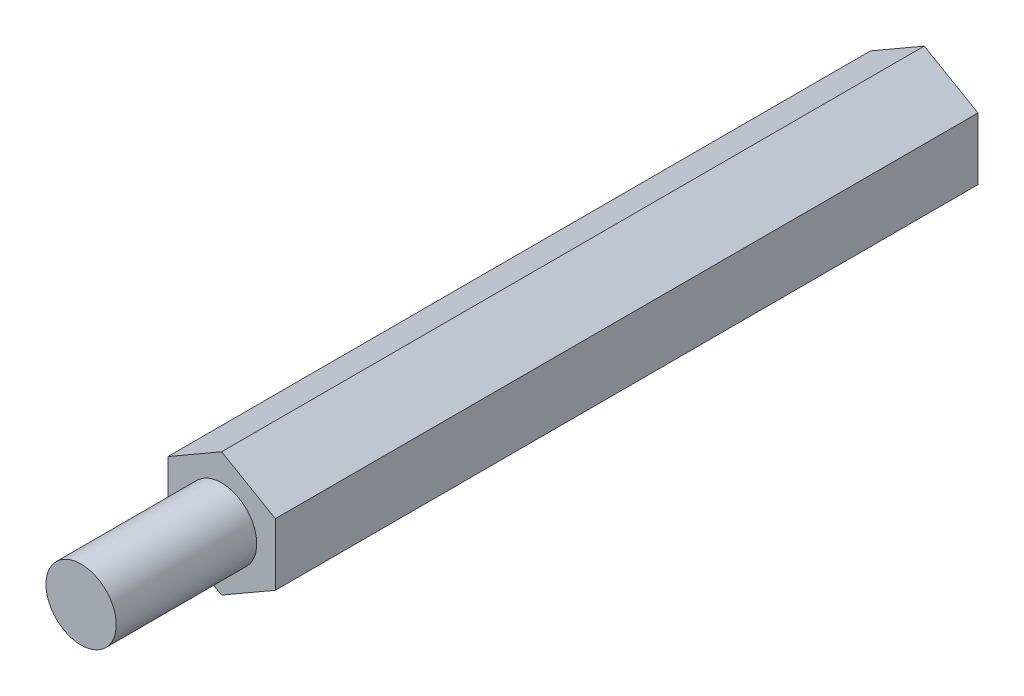
ISO-10303-21;
HEADER;
FILE_DESCRIPTION(('STEP AP214'),'2;1');
FILE_NAME('part.step','',(''),(''),'','','');
FILE_SCHEMA(('AUTOMOTIVE_DESIGN { 1 0 10303 214 1 1 1 1 }'));
ENDSEC;
DATA;
#1=APPLICATION_CONTEXT('core data for automotive mechanical design processes');
#2=APPLICATION_PROTOCOL_DEFINITION('international standard','automotive_design',2000,#1);
#3=PRODUCT_CONTEXT('',#1,'mechanical');
#4=PRODUCT('Part','Part','',(#3));
#5=PRODUCT_RELATED_PRODUCT_CATEGORY('part','',(#4));
#6=PRODUCT_DEFINITION_FORMATION('','',#4);
#7=PRODUCT_DEFINITION_CONTEXT('part definition',#1,'design');
#8=PRODUCT_DEFINITION('design','',#6,#7);
#9=PRODUCT_DEFINITION_SHAPE('','',#8);
#10=(LENGTH_UNIT() NAMED_UNIT(*) SI_UNIT(.MILLI.,.METRE.));
#11=(NAMED_UNIT(*) PLANE_ANGLE_UNIT() SI_UNIT($,.RADIAN.));
#12=(NAMED_UNIT(*) SI_UNIT($,.STERADIAN.) SOLID_ANGLE_UNIT());
#13=UNCERTAINTY_MEASURE_WITH_UNIT(LENGTH_MEASURE(1.E-05),#10,'distance_accuracy_value','');
#14=(GEOMETRIC_REPRESENTATION_CONTEXT(3) GLOBAL_UNCERTAINTY_ASSIGNED_CONTEXT((#13)) GLOBAL_UNIT_ASSIGNED_CONTEXT((#10,
#11,#12)) REPRESENTATION_CONTEXT('',''));
#15=CARTESIAN_POINT('',(0.,0.,0.));
#16=DIRECTION('',(0.,0.,1.));
#17=DIRECTION('',(1.,0.,0.));
#18=AXIS2_PLACEMENT_3D('',#15,#16,#17);
#19=CARTESIAN_POINT('',(2.29496732002877,1.325,30.));
#20=DIRECTION('',(-0.500000000000001,-0.866025403784438,0.));
#21=DIRECTION('',(0.866025403784438,-0.500000000000001,0.));
#22=AXIS2_PLACEMENT_3D('',#19,#20,#21);
#23=PLANE('',#22);
#24=DIRECTION('',(-0.866025403784438,0.500000000000001,0.));
#25=VECTOR('',#24,1.);
#26=CARTESIAN_POINT('',(2.29496732002877,1.325,0.));
#27=LINE('',#26,#25);
#28=CARTESIAN_POINT('',(2.29496732002877,1.325,0.));
#29=VERTEX_POINT('',#28);
#30=CARTESIAN_POINT('',(0.,2.65,0.));
#31=VERTEX_POINT('',#30);
#32=EDGE_CURVE('E130',#29,#31,#27,.T.);
#33=ORIENTED_EDGE('',*,*,#32,.T.);
#34=DIRECTION('',(0.,0.,-1.));
#35=VECTOR('',#34,1.);
#36=CARTESIAN_POINT('',(0.,2.65,30.));
#37=LINE('',#36,#35);
#38=CARTESIAN_POINT('',(0.,2.65,30.));
#39=VERTEX_POINT('',#38);
#40=EDGE_CURVE('E42',#39,#31,#37,.T.);
#41=ORIENTED_EDGE('',*,*,#40,.F.);
#42=DIRECTION('',(-0.866025403784438,0.500000000000001,0.));
#43=VECTOR('',#42,1.);
#44=CARTESIAN_POINT('',(2.29496732002877,1.325,30.));
#45=LINE('',#44,#43);
#46=CARTESIAN_POINT('',(2.29496732002877,1.325,30.));
#47=VERTEX_POINT('',#46);
#48=EDGE_CURVE('E147',#47,#39,#45,.T.);
#49=ORIENTED_EDGE('',*,*,#48,.F.);
#50=DIRECTION('',(0.,0.,-1.));
#51=VECTOR('',#50,1.);
#52=CARTESIAN_POINT('',(2.29496732002877,1.325,30.));
#53=LINE('',#52,#51);
#54=EDGE_CURVE('E126',#47,#29,#53,.T.);
#55=ORIENTED_EDGE('',*,*,#54,.T.);
#56=EDGE_LOOP('',(#33,#41,#49,#55));
#57=FACE_BOUND('',#56,.T.);
#58=ADVANCED_FACE('F39',(#57),#23,.F.);
#59=CARTESIAN_POINT('',(0.,2.65,30.));
#60=DIRECTION('',(0.5,-0.866025403784439,0.));
#61=DIRECTION('',(0.866025403784439,0.5,0.));
#62=AXIS2_PLACEMENT_3D('',#59,#60,#61);
#63=PLANE('',#62);
#64=DIRECTION('',(-0.866025403784439,-0.5,0.));
#65=VECTOR('',#64,1.);
#66=CARTESIAN_POINT('',(0.,2.65,0.));
#67=LINE('',#66,#65);
#68=CARTESIAN_POINT('',(-2.29496732002876,1.325,0.));
#69=VERTEX_POINT('',#68);
#70=EDGE_CURVE('E134',#31,#69,#67,.T.);
#71=ORIENTED_EDGE('',*,*,#70,.T.);
#72=DIRECTION('',(0.,0.,-1.));
#73=VECTOR('',#72,1.);
#74=CARTESIAN_POINT('',(-2.29496732002876,1.325,30.));
#75=LINE('',#74,#73);
#76=CARTESIAN_POINT('',(-2.29496732002876,1.325,30.));
#77=VERTEX_POINT('',#76);
#78=EDGE_CURVE('E153',#77,#69,#75,.T.);
#79=ORIENTED_EDGE('',*,*,#78,.F.);
#80=DIRECTION('',(-0.866025403784439,-0.5,0.));
#81=VECTOR('',#80,1.);
#82=CARTESIAN_POINT('',(0.,2.65,30.));
#83=LINE('',#82,#81);
#84=EDGE_CURVE('E95',#39,#77,#83,.T.);
#85=ORIENTED_EDGE('',*,*,#84,.F.);
#86=ORIENTED_EDGE('',*,*,#40,.T.);
#87=EDGE_LOOP('',(#71,#79,#85,#86));
#88=FACE_BOUND('',#87,.T.);
#89=ADVANCED_FACE('F160',(#88),#63,.F.);
#90=CARTESIAN_POINT('',(-2.29496732002876,1.325,30.));
#91=DIRECTION('',(1.,0.,0.));
#92=DIRECTION('',(0.,0.,-1.));
#93=AXIS2_PLACEMENT_3D('',#90,#91,#92);
#94=PLANE('',#93);
#95=DIRECTION('',(0.,-1.,0.));
#96=VECTOR('',#95,1.);
#97=CARTESIAN_POINT('',(-2.29496732002876,1.325,0.));
#98=LINE('',#97,#96);
#99=CARTESIAN_POINT('',(-2.29496732002876,-1.325,0.));
#100=VERTEX_POINT('',#99);
#101=EDGE_CURVE('E138',#69,#100,#98,.T.);
#102=ORIENTED_EDGE('',*,*,#101,.T.);
#103=DIRECTION('',(0.,0.,-1.));
#104=VECTOR('',#103,1.);
#105=CARTESIAN_POINT('',(-2.29496732002876,-1.325,30.));
#106=LINE('',#105,#104);
#107=CARTESIAN_POINT('',(-2.29496732002876,-1.325,30.));
#108=VERTEX_POINT('',#107);
#109=EDGE_CURVE('E119',#108,#100,#106,.T.);
#110=ORIENTED_EDGE('',*,*,#109,.F.);
#111=DIRECTION('',(0.,-1.,0.));
#112=VECTOR('',#111,1.);
#113=CARTESIAN_POINT('',(-2.29496732002876,1.325,30.));
#114=LINE('',#113,#112);
#115=EDGE_CURVE('E108',#77,#108,#114,.T.);
#116=ORIENTED_EDGE('',*,*,#115,.F.);
#117=ORIENTED_EDGE('',*,*,#78,.T.);
#118=EDGE_LOOP('',(#102,#110,#116,#117));
#119=FACE_BOUND('',#118,.T.);
#120=ADVANCED_FACE('F166',(#119),#94,.F.);
#121=CARTESIAN_POINT('',(-2.29496732002876,-1.325,30.));
#122=DIRECTION('',(0.5,0.866025403784438,0.));
#123=DIRECTION('',(-0.866025403784438,0.5,0.));
#124=AXIS2_PLACEMENT_3D('',#121,#122,#123);
#125=PLANE('',#124);
#126=DIRECTION('',(0.866025403784438,-0.5,0.));
#127=VECTOR('',#126,1.);
#128=CARTESIAN_POINT('',(-2.29496732002876,-1.325,0.));
#129=LINE('',#128,#127);
#130=CARTESIAN_POINT('',(0.,-2.65,0.));
#131=VERTEX_POINT('',#130);
#132=EDGE_CURVE('E117',#100,#131,#129,.T.);
#133=ORIENTED_EDGE('',*,*,#132,.T.);
#134=DIRECTION('',(0.,0.,-1.));
#135=VECTOR('',#134,1.);
#136=CARTESIAN_POINT('',(0.,-2.65,30.));
#137=LINE('',#136,#135);
#138=CARTESIAN_POINT('',(0.,-2.65,30.));
#139=VERTEX_POINT('',#138);
#140=EDGE_CURVE('E114',#139,#131,#137,.T.);
#141=ORIENTED_EDGE('',*,*,#140,.F.);
#142=DIRECTION('',(0.866025403784438,-0.5,0.));
#143=VECTOR('',#142,1.);
#144=CARTESIAN_POINT('',(-2.29496732002876,-1.325,30.));
#145=LINE('',#144,#143);
#146=EDGE_CURVE('E102',#108,#139,#145,.T.);
#147=ORIENTED_EDGE('',*,*,#146,.F.);
#148=ORIENTED_EDGE('',*,*,#109,.T.);
#149=EDGE_LOOP('',(#133,#141,#147,#148));
#150=FACE_BOUND('',#149,.T.);
#151=ADVANCED_FACE('F115',(#150),#125,.F.);
#152=CARTESIAN_POINT('',(0.,-2.65,30.));
#153=DIRECTION('',(-0.500000000000001,0.866025403784438,0.));
#154=DIRECTION('',(-0.866025403784438,-0.500000000000001,0.));
#155=AXIS2_PLACEMENT_3D('',#152,#153,#154);
#156=PLANE('',#155);
#157=DIRECTION('',(0.866025403784438,0.500000000000001,0.));
#158=VECTOR('',#157,1.);
#159=CARTESIAN_POINT('',(0.,-2.65,0.));
#160=LINE('',#159,#158);
#161=CARTESIAN_POINT('',(2.29496732002877,-1.325,0.));
#162=VERTEX_POINT('',#161);
#163=EDGE_CURVE('E80',#131,#162,#160,.T.);
#164=ORIENTED_EDGE('',*,*,#163,.T.);
#165=DIRECTION('',(0.,0.,-1.));
#166=VECTOR('',#165,1.);
#167=CARTESIAN_POINT('',(2.29496732002877,-1.325,30.));
#168=LINE('',#167,#166);
#169=CARTESIAN_POINT('',(2.29496732002877,-1.325,30.));
#170=VERTEX_POINT('',#169);
#171=EDGE_CURVE('E120',#170,#162,#168,.T.);
#172=ORIENTED_EDGE('',*,*,#171,.F.);
#173=DIRECTION('',(0.866025403784438,0.500000000000001,0.));
#174=VECTOR('',#173,1.);
#175=CARTESIAN_POINT('',(0.,-2.65,30.));
#176=LINE('',#175,#174);
#177=EDGE_CURVE('E106',#139,#170,#176,.T.);
#178=ORIENTED_EDGE('',*,*,#177,.F.);
#179=ORIENTED_EDGE('',*,*,#140,.T.);
#180=EDGE_LOOP('',(#164,#172,#178,#179));
#181=FACE_BOUND('',#180,.T.);
#182=ADVANCED_FACE('F122',(#181),#156,.F.);
#183=CARTESIAN_POINT('',(2.29496732002877,-1.325,30.));
#184=DIRECTION('',(-1.,0.,0.));
#185=DIRECTION('',(0.,0.,1.));
#186=AXIS2_PLACEMENT_3D('',#183,#184,#185);
#187=PLANE('',#186);
#188=DIRECTION('',(0.,1.,0.));
#189=VECTOR('',#188,1.);
#190=CARTESIAN_POINT('',(2.29496732002877,-1.325,0.));
#191=LINE('',#190,#189);
#192=EDGE_CURVE('E86',#162,#29,#191,.T.);
#193=ORIENTED_EDGE('',*,*,#192,.T.);
#194=ORIENTED_EDGE('',*,*,#54,.F.);
#195=DIRECTION('',(0.,1.,0.));
#196=VECTOR('',#195,1.);
#197=CARTESIAN_POINT('',(2.29496732002877,-1.325,30.));
#198=LINE('',#197,#196);
#199=EDGE_CURVE('E57',#170,#47,#198,.T.);
#200=ORIENTED_EDGE('',*,*,#199,.F.);
#201=ORIENTED_EDGE('',*,*,#171,.T.);
#202=EDGE_LOOP('',(#193,#194,#200,#201));
#203=FACE_BOUND('',#202,.T.);
#204=ADVANCED_FACE('F195',(#203),#187,.F.);
#205=CARTESIAN_POINT('',(0.,0.,30.));
#206=DIRECTION('',(0.,0.,1.));
#207=DIRECTION('',(1.,0.,0.));
#208=AXIS2_PLACEMENT_3D('',#205,#206,#207);
#209=PLANE('',#208);
#210=CARTESIAN_POINT('',(0.,0.,30.));
#211=DIRECTION('',(0.,0.,1.));
#212=DIRECTION('',(1.,0.,0.));
#213=AXIS2_PLACEMENT_3D('',#210,#211,#212);
#214=CIRCLE('',#213,1.5);
#215=CARTESIAN_POINT('',(1.5,0.,30.));
#216=VERTEX_POINT('',#215);
#217=EDGE_CURVE('E11',#216,#216,#214,.T.);
#218=ORIENTED_EDGE('',*,*,#217,.F.);
#219=EDGE_LOOP('',(#218));
#220=FACE_BOUND('',#219,.T.);
#221=ORIENTED_EDGE('',*,*,#48,.T.);
#222=ORIENTED_EDGE('',*,*,#84,.T.);
#223=ORIENTED_EDGE('',*,*,#115,.T.);
#224=ORIENTED_EDGE('',*,*,#146,.T.);
#225=ORIENTED_EDGE('',*,*,#177,.T.);
#226=ORIENTED_EDGE('',*,*,#199,.T.);
#227=EDGE_LOOP('',(#221,#222,#223,#224,#225,#226));
#228=FACE_BOUND('',#227,.T.);
#229=ADVANCED_FACE('F104',(#220,#228),#209,.T.);
#230=CARTESIAN_POINT('',(0.,0.,0.));
#231=DIRECTION('',(0.,0.,1.));
#232=DIRECTION('',(1.,0.,0.));
#233=AXIS2_PLACEMENT_3D('',#230,#231,#232);
#234=PLANE('',#233);
#235=CARTESIAN_POINT('',(0.,0.,0.));
#236=DIRECTION('',(0.,0.,-1.));
#237=DIRECTION('',(-1.,0.,0.));
#238=AXIS2_PLACEMENT_3D('',#235,#236,#237);
#239=CIRCLE('',#238,1.5);
#240=CARTESIAN_POINT('',(-1.5,0.,0.));
#241=VERTEX_POINT('',#240);
#242=EDGE_CURVE('E173',#241,#241,#239,.T.);
#243=ORIENTED_EDGE('',*,*,#242,.F.);
#244=EDGE_LOOP('',(#243));
#245=FACE_BOUND('',#244,.T.);
#246=ORIENTED_EDGE('',*,*,#32,.F.);
#247=ORIENTED_EDGE('',*,*,#192,.F.);
#248=ORIENTED_EDGE('',*,*,#163,.F.);
#249=ORIENTED_EDGE('',*,*,#132,.F.);
#250=ORIENTED_EDGE('',*,*,#101,.F.);
#251=ORIENTED_EDGE('',*,*,#70,.F.);
#252=EDGE_LOOP('',(#246,#247,#248,#249,#250,#251));
#253=FACE_BOUND('',#252,.T.);
#254=ADVANCED_FACE('F165',(#245,#253),#234,.F.);
#255=CARTESIAN_POINT('',(0.,0.,6.));
#256=DIRECTION('',(0.,0.,-1.));
#257=DIRECTION('',(-1.,0.,0.));
#258=AXIS2_PLACEMENT_3D('',#255,#256,#257);
#259=CYLINDRICAL_SURFACE('',#258,1.5);
#260=CARTESIAN_POINT('',(0.,0.,6.));
#261=DIRECTION('',(0.,0.,-1.));
#262=DIRECTION('',(-1.,0.,0.));
#263=AXIS2_PLACEMENT_3D('',#260,#261,#262);
#264=CIRCLE('',#263,1.5);
#265=CARTESIAN_POINT('',(-1.5,0.,6.));
#266=VERTEX_POINT('',#265);
#267=EDGE_CURVE('E135',#266,#266,#264,.T.);
#268=ORIENTED_EDGE('',*,*,#267,.F.);
#269=EDGE_LOOP('',(#268));
#270=FACE_BOUND('',#269,.T.);
#271=ORIENTED_EDGE('',*,*,#242,.T.);
#272=EDGE_LOOP('',(#271));
#273=FACE_BOUND('',#272,.T.);
#274=ADVANCED_FACE('F201',(#270,#273),#259,.F.);
#275=CARTESIAN_POINT('',(0.,0.,6.));
#276=DIRECTION('',(0.,0.,-1.));
#277=DIRECTION('',(-1.,0.,0.));
#278=AXIS2_PLACEMENT_3D('',#275,#276,#277);
#279=PLANE('',#278);
#280=ORIENTED_EDGE('',*,*,#267,.T.);
#281=EDGE_LOOP('',(#280));
#282=FACE_BOUND('',#281,.T.);
#283=ADVANCED_FACE('F190',(#282),#279,.T.);
#284=CARTESIAN_POINT('',(0.,0.,36.));
#285=DIRECTION('',(0.,0.,-1.));
#286=DIRECTION('',(-1.,0.,0.));
#287=AXIS2_PLACEMENT_3D('',#284,#285,#286);
#288=CYLINDRICAL_SURFACE('',#287,1.5);
#289=CARTESIAN_POINT('',(0.,0.,36.));
#290=DIRECTION('',(0.,0.,1.));
#291=DIRECTION('',(1.,0.,0.));
#292=AXIS2_PLACEMENT_3D('',#289,#290,#291);
#293=CIRCLE('',#292,1.5);
#294=CARTESIAN_POINT('',(1.5,0.,36.));
#295=VERTEX_POINT('',#294);
#296=EDGE_CURVE('E177',#295,#295,#293,.T.);
#297=ORIENTED_EDGE('',*,*,#296,.F.);
#298=EDGE_LOOP('',(#297));
#299=FACE_BOUND('',#298,.T.);
#300=ORIENTED_EDGE('',*,*,#217,.T.);
#301=EDGE_LOOP('',(#300));
#302=FACE_BOUND('',#301,.T.);
#303=ADVANCED_FACE('F187',(#299,#302),#288,.T.);
#304=CARTESIAN_POINT('',(0.,0.,36.));
#305=DIRECTION('',(0.,0.,1.));
#306=DIRECTION('',(1.,0.,0.));
#307=AXIS2_PLACEMENT_3D('',#304,#305,#306);
#308=PLANE('',#307);
#309=ORIENTED_EDGE('',*,*,#296,.T.);
#310=EDGE_LOOP('',(#309));
#311=FACE_BOUND('',#310,.T.);
#312=ADVANCED_FACE('F185',(#311),#308,.T.);
#313=CLOSED_SHELL('',(#58,#89,#120,#151,#182,#204,#229,#254,#274,#283,#303,#312));
#314=MANIFOLD_SOLID_BREP('B2',#313);
#315=ADVANCED_BREP_SHAPE_REPRESENTATION('',(#18,#314),#14);
#316=SHAPE_DEFINITION_REPRESENTATION(#9,#315);
ENDSEC;
END-ISO-10303-21;
